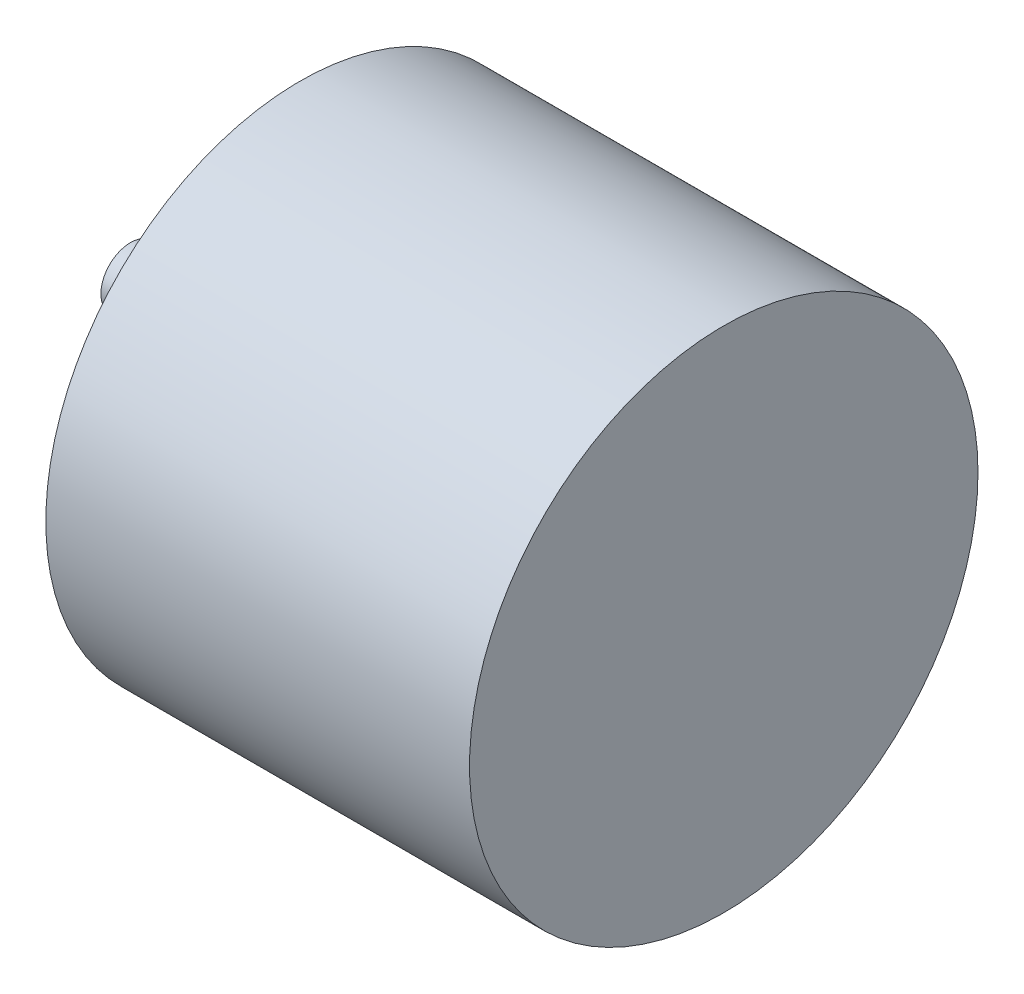
ISO-10303-21;
HEADER;
FILE_DESCRIPTION(('STEP AP214'),'2;1');
FILE_NAME('part.step','',(''),(''),'','','');
FILE_SCHEMA(('AUTOMOTIVE_DESIGN { 1 0 10303 214 1 1 1 1 }'));
ENDSEC;
DATA;
#1=APPLICATION_CONTEXT('core data for automotive mechanical design processes');
#2=APPLICATION_PROTOCOL_DEFINITION('international standard','automotive_design',2000,#1);
#3=PRODUCT_CONTEXT('',#1,'mechanical');
#4=PRODUCT('Part','Part','',(#3));
#5=PRODUCT_RELATED_PRODUCT_CATEGORY('part','',(#4));
#6=PRODUCT_DEFINITION_FORMATION('','',#4);
#7=PRODUCT_DEFINITION_CONTEXT('part definition',#1,'design');
#8=PRODUCT_DEFINITION('design','',#6,#7);
#9=PRODUCT_DEFINITION_SHAPE('','',#8);
#10=(LENGTH_UNIT() NAMED_UNIT(*) SI_UNIT(.MILLI.,.METRE.));
#11=(NAMED_UNIT(*) PLANE_ANGLE_UNIT() SI_UNIT($,.RADIAN.));
#12=(NAMED_UNIT(*) SI_UNIT($,.STERADIAN.) SOLID_ANGLE_UNIT());
#13=UNCERTAINTY_MEASURE_WITH_UNIT(LENGTH_MEASURE(1.E-05),#10,'distance_accuracy_value','');
#14=(GEOMETRIC_REPRESENTATION_CONTEXT(3) GLOBAL_UNCERTAINTY_ASSIGNED_CONTEXT((#13)) GLOBAL_UNIT_ASSIGNED_CONTEXT((#10,
#11,#12)) REPRESENTATION_CONTEXT('',''));
#15=CARTESIAN_POINT('',(0.,0.,0.));
#16=DIRECTION('',(0.,0.,1.));
#17=DIRECTION('',(1.,0.,0.));
#18=AXIS2_PLACEMENT_3D('',#15,#16,#17);
#19=CARTESIAN_POINT('',(50.,0.,0.));
#20=DIRECTION('',(-1.,0.,0.));
#21=DIRECTION('',(0.,0.,1.));
#22=AXIS2_PLACEMENT_3D('',#19,#20,#21);
#23=CYLINDRICAL_SURFACE('',#22,30.);
#24=CARTESIAN_POINT('',(50.,0.,0.));
#25=DIRECTION('',(1.,0.,0.));
#26=DIRECTION('',(0.,0.,-1.));
#27=AXIS2_PLACEMENT_3D('',#24,#25,#26);
#28=CIRCLE('',#27,30.);
#29=CARTESIAN_POINT('',(50.,0.,-30.));
#30=VERTEX_POINT('',#29);
#31=EDGE_CURVE('E44',#30,#30,#28,.T.);
#32=ORIENTED_EDGE('',*,*,#31,.F.);
#33=EDGE_LOOP('',(#32));
#34=FACE_BOUND('',#33,.T.);
#35=CARTESIAN_POINT('',(0.,0.,0.));
#36=DIRECTION('',(1.,0.,0.));
#37=DIRECTION('',(0.,0.,-1.));
#38=AXIS2_PLACEMENT_3D('',#35,#36,#37);
#39=CIRCLE('',#38,30.);
#40=CARTESIAN_POINT('',(0.,0.,-30.));
#41=VERTEX_POINT('',#40);
#42=EDGE_CURVE('E49',#41,#41,#39,.T.);
#43=ORIENTED_EDGE('',*,*,#42,.T.);
#44=EDGE_LOOP('',(#43));
#45=FACE_BOUND('',#44,.T.);
#46=ADVANCED_FACE('F37',(#34,#45),#23,.T.);
#47=CARTESIAN_POINT('',(50.,0.,0.));
#48=DIRECTION('',(1.,0.,0.));
#49=DIRECTION('',(0.,0.,-1.));
#50=AXIS2_PLACEMENT_3D('',#47,#48,#49);
#51=PLANE('',#50);
#52=ORIENTED_EDGE('',*,*,#31,.T.);
#53=EDGE_LOOP('',(#52));
#54=FACE_BOUND('',#53,.T.);
#55=ADVANCED_FACE('F72',(#54),#51,.T.);
#56=CARTESIAN_POINT('',(0.,0.,0.));
#57=DIRECTION('',(1.,0.,0.));
#58=DIRECTION('',(0.,0.,-1.));
#59=AXIS2_PLACEMENT_3D('',#56,#57,#58);
#60=PLANE('',#59);
#61=CARTESIAN_POINT('',(0.,0.,0.));
#62=DIRECTION('',(1.,0.,0.));
#63=DIRECTION('',(0.,0.,-1.));
#64=AXIS2_PLACEMENT_3D('',#61,#62,#63);
#65=CIRCLE('',#64,3.5);
#66=CARTESIAN_POINT('',(0.,0.,-3.5));
#67=VERTEX_POINT('',#66);
#68=EDGE_CURVE('E10',#67,#67,#65,.F.);
#69=ORIENTED_EDGE('',*,*,#68,.F.);
#70=EDGE_LOOP('',(#69));
#71=FACE_BOUND('',#70,.T.);
#72=ORIENTED_EDGE('',*,*,#42,.F.);
#73=EDGE_LOOP('',(#72));
#74=FACE_BOUND('',#73,.T.);
#75=ADVANCED_FACE('F65',(#71,#74),#60,.F.);
#76=CARTESIAN_POINT('',(-20.,0.,0.));
#77=DIRECTION('',(1.,0.,0.));
#78=DIRECTION('',(0.,0.,-1.));
#79=AXIS2_PLACEMENT_3D('',#76,#77,#78);
#80=CYLINDRICAL_SURFACE('',#79,3.5);
#81=CARTESIAN_POINT('',(-20.,0.,0.));
#82=DIRECTION('',(-1.,0.,0.));
#83=DIRECTION('',(0.,0.,1.));
#84=AXIS2_PLACEMENT_3D('',#81,#82,#83);
#85=CIRCLE('',#84,3.5);
#86=CARTESIAN_POINT('',(-20.,0.,3.5));
#87=VERTEX_POINT('',#86);
#88=EDGE_CURVE('E55',#87,#87,#85,.T.);
#89=ORIENTED_EDGE('',*,*,#88,.F.);
#90=EDGE_LOOP('',(#89));
#91=FACE_BOUND('',#90,.T.);
#92=ORIENTED_EDGE('',*,*,#68,.T.);
#93=EDGE_LOOP('',(#92));
#94=FACE_BOUND('',#93,.T.);
#95=ADVANCED_FACE('F63',(#91,#94),#80,.T.);
#96=CARTESIAN_POINT('',(-20.,0.,0.));
#97=DIRECTION('',(-1.,0.,0.));
#98=DIRECTION('',(0.,0.,1.));
#99=AXIS2_PLACEMENT_3D('',#96,#97,#98);
#100=PLANE('',#99);
#101=ORIENTED_EDGE('',*,*,#88,.T.);
#102=EDGE_LOOP('',(#101));
#103=FACE_BOUND('',#102,.T.);
#104=ADVANCED_FACE('F61',(#103),#100,.T.);
#105=CLOSED_SHELL('',(#46,#55,#75,#95,#104));
#106=MANIFOLD_SOLID_BREP('B2',#105);
#107=ADVANCED_BREP_SHAPE_REPRESENTATION('',(#18,#106),#14);
#108=SHAPE_DEFINITION_REPRESENTATION(#9,#107);
ENDSEC;
END-ISO-10303-21;
